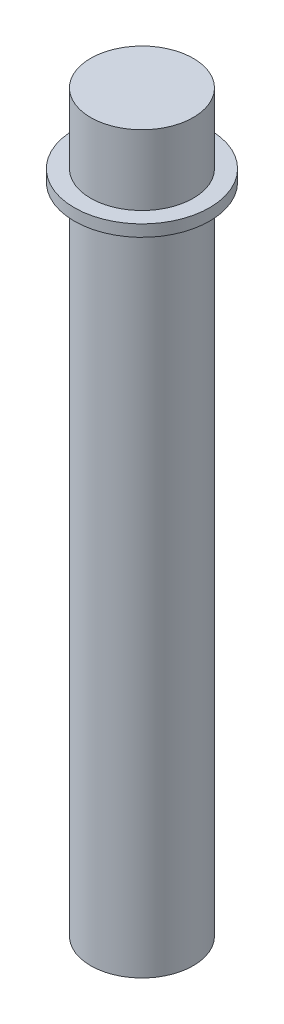
ISO-10303-21;
HEADER;
FILE_DESCRIPTION(('STEP AP214'),'2;1');
FILE_NAME('part.step','',(''),(''),'','','');
FILE_SCHEMA(('AUTOMOTIVE_DESIGN { 1 0 10303 214 1 1 1 1 }'));
ENDSEC;
DATA;
#1=APPLICATION_CONTEXT('core data for automotive mechanical design processes');
#2=APPLICATION_PROTOCOL_DEFINITION('international standard','automotive_design',2000,#1);
#3=PRODUCT_CONTEXT('',#1,'mechanical');
#4=PRODUCT('Part','Part','',(#3));
#5=PRODUCT_RELATED_PRODUCT_CATEGORY('part','',(#4));
#6=PRODUCT_DEFINITION_FORMATION('','',#4);
#7=PRODUCT_DEFINITION_CONTEXT('part definition',#1,'design');
#8=PRODUCT_DEFINITION('design','',#6,#7);
#9=PRODUCT_DEFINITION_SHAPE('','',#8);
#10=(LENGTH_UNIT() NAMED_UNIT(*) SI_UNIT(.MILLI.,.METRE.));
#11=(NAMED_UNIT(*) PLANE_ANGLE_UNIT() SI_UNIT($,.RADIAN.));
#12=(NAMED_UNIT(*) SI_UNIT($,.STERADIAN.) SOLID_ANGLE_UNIT());
#13=UNCERTAINTY_MEASURE_WITH_UNIT(LENGTH_MEASURE(1.E-05),#10,'distance_accuracy_value','');
#14=(GEOMETRIC_REPRESENTATION_CONTEXT(3) GLOBAL_UNCERTAINTY_ASSIGNED_CONTEXT((#13)) GLOBAL_UNIT_ASSIGNED_CONTEXT((#10,
#11,#12)) REPRESENTATION_CONTEXT('',''));
#15=CARTESIAN_POINT('',(0.,0.,0.));
#16=DIRECTION('',(0.,0.,1.));
#17=DIRECTION('',(1.,0.,0.));
#18=AXIS2_PLACEMENT_3D('',#15,#16,#17);
#19=CARTESIAN_POINT('',(0.,-21.5,0.));
#20=DIRECTION('',(0.,1.,0.));
#21=DIRECTION('',(0.,0.,1.));
#22=AXIS2_PLACEMENT_3D('',#19,#20,#21);
#23=CYLINDRICAL_SURFACE('',#22,2.2);
#24=CARTESIAN_POINT('',(0.,-21.5,0.));
#25=DIRECTION('',(0.,1.,0.));
#26=DIRECTION('',(0.,0.,1.));
#27=AXIS2_PLACEMENT_3D('',#24,#25,#26);
#28=CIRCLE('',#27,2.2);
#29=CARTESIAN_POINT('',(0.,-21.5,2.2));
#30=VERTEX_POINT('',#29);
#31=EDGE_CURVE('E44',#30,#30,#28,.T.);
#32=ORIENTED_EDGE('',*,*,#31,.T.);
#33=EDGE_LOOP('',(#32));
#34=FACE_BOUND('',#33,.T.);
#35=CARTESIAN_POINT('',(0.,6.5,0.));
#36=DIRECTION('',(0.,1.,0.));
#37=DIRECTION('',(0.,0.,1.));
#38=AXIS2_PLACEMENT_3D('',#35,#36,#37);
#39=CIRCLE('',#38,2.2);
#40=CARTESIAN_POINT('',(0.,6.5,2.2));
#41=VERTEX_POINT('',#40);
#42=EDGE_CURVE('E58',#41,#41,#39,.T.);
#43=ORIENTED_EDGE('',*,*,#42,.F.);
#44=EDGE_LOOP('',(#43));
#45=FACE_BOUND('',#44,.T.);
#46=ADVANCED_FACE('F37',(#34,#45),#23,.T.);
#47=CARTESIAN_POINT('',(0.,-21.5,0.));
#48=DIRECTION('',(0.,1.,0.));
#49=DIRECTION('',(0.,0.,1.));
#50=AXIS2_PLACEMENT_3D('',#47,#48,#49);
#51=PLANE('',#50);
#52=ORIENTED_EDGE('',*,*,#31,.F.);
#53=EDGE_LOOP('',(#52));
#54=FACE_BOUND('',#53,.T.);
#55=ADVANCED_FACE('F68',(#54),#51,.F.);
#56=CARTESIAN_POINT('',(0.,6.5,0.));
#57=DIRECTION('',(0.,1.,0.));
#58=DIRECTION('',(0.,0.,1.));
#59=AXIS2_PLACEMENT_3D('',#56,#57,#58);
#60=CYLINDRICAL_SURFACE('',#59,2.90000000000001);
#61=CARTESIAN_POINT('',(0.,6.5,0.));
#62=DIRECTION('',(0.,1.,0.));
#63=DIRECTION('',(0.,0.,1.));
#64=AXIS2_PLACEMENT_3D('',#61,#62,#63);
#65=CIRCLE('',#64,2.90000000000001);
#66=CARTESIAN_POINT('',(0.,6.5,2.90000000000001));
#67=VERTEX_POINT('',#66);
#68=EDGE_CURVE('E52',#67,#67,#65,.T.);
#69=ORIENTED_EDGE('',*,*,#68,.T.);
#70=EDGE_LOOP('',(#69));
#71=FACE_BOUND('',#70,.T.);
#72=CARTESIAN_POINT('',(0.,7.,0.));
#73=DIRECTION('',(0.,1.,0.));
#74=DIRECTION('',(0.,0.,1.));
#75=AXIS2_PLACEMENT_3D('',#72,#73,#74);
#76=CIRCLE('',#75,2.90000000000001);
#77=CARTESIAN_POINT('',(0.,7.,2.90000000000001));
#78=VERTEX_POINT('',#77);
#79=EDGE_CURVE('E55',#78,#78,#76,.T.);
#80=ORIENTED_EDGE('',*,*,#79,.F.);
#81=EDGE_LOOP('',(#80));
#82=FACE_BOUND('',#81,.T.);
#83=ADVANCED_FACE('F72',(#71,#82),#60,.T.);
#84=CARTESIAN_POINT('',(0.,6.5,0.));
#85=DIRECTION('',(0.,1.,0.));
#86=DIRECTION('',(0.,0.,1.));
#87=AXIS2_PLACEMENT_3D('',#84,#85,#86);
#88=PLANE('',#87);
#89=ORIENTED_EDGE('',*,*,#42,.T.);
#90=EDGE_LOOP('',(#89));
#91=FACE_BOUND('',#90,.T.);
#92=ORIENTED_EDGE('',*,*,#68,.F.);
#93=EDGE_LOOP('',(#92));
#94=FACE_BOUND('',#93,.T.);
#95=ADVANCED_FACE('F64',(#91,#94),#88,.F.);
#96=CARTESIAN_POINT('',(0.,7.,0.));
#97=DIRECTION('',(0.,1.,0.));
#98=DIRECTION('',(0.,0.,1.));
#99=AXIS2_PLACEMENT_3D('',#96,#97,#98);
#100=PLANE('',#99);
#101=CARTESIAN_POINT('',(0.,7.,0.));
#102=DIRECTION('',(0.,1.,0.));
#103=DIRECTION('',(0.,0.,1.));
#104=AXIS2_PLACEMENT_3D('',#101,#102,#103);
#105=CIRCLE('',#104,2.2);
#106=CARTESIAN_POINT('',(0.,7.,2.2));
#107=VERTEX_POINT('',#106);
#108=EDGE_CURVE('E10',#107,#107,#105,.F.);
#109=ORIENTED_EDGE('',*,*,#108,.T.);
#110=EDGE_LOOP('',(#109));
#111=FACE_BOUND('',#110,.T.);
#112=ORIENTED_EDGE('',*,*,#79,.T.);
#113=EDGE_LOOP('',(#112));
#114=FACE_BOUND('',#113,.T.);
#115=ADVANCED_FACE('F80',(#111,#114),#100,.T.);
#116=CARTESIAN_POINT('',(0.,10.,0.));
#117=DIRECTION('',(0.,1.,0.));
#118=DIRECTION('',(0.,0.,1.));
#119=AXIS2_PLACEMENT_3D('',#116,#117,#118);
#120=PLANE('',#119);
#121=CARTESIAN_POINT('',(0.,10.,0.));
#122=DIRECTION('',(0.,1.,0.));
#123=DIRECTION('',(0.,0.,1.));
#124=AXIS2_PLACEMENT_3D('',#121,#122,#123);
#125=CIRCLE('',#124,2.2);
#126=CARTESIAN_POINT('',(0.,10.,2.2));
#127=VERTEX_POINT('',#126);
#128=EDGE_CURVE('E48',#127,#127,#125,.T.);
#129=ORIENTED_EDGE('',*,*,#128,.T.);
#130=EDGE_LOOP('',(#129));
#131=FACE_BOUND('',#130,.T.);
#132=ADVANCED_FACE('F75',(#131),#120,.T.);
#133=ORIENTED_EDGE('',*,*,#108,.F.);
#134=EDGE_LOOP('',(#133));
#135=FACE_BOUND('',#134,.T.);
#136=ORIENTED_EDGE('',*,*,#128,.F.);
#137=EDGE_LOOP('',(#136));
#138=FACE_BOUND('',#137,.T.);
#139=ADVANCED_FACE('F39',(#135,#138),#23,.T.);
#140=CLOSED_SHELL('',(#46,#55,#83,#95,#115,#132,#139));
#141=MANIFOLD_SOLID_BREP('B2',#140);
#142=ADVANCED_BREP_SHAPE_REPRESENTATION('',(#18,#141),#14);
#143=SHAPE_DEFINITION_REPRESENTATION(#9,#142);
ENDSEC;
END-ISO-10303-21;
